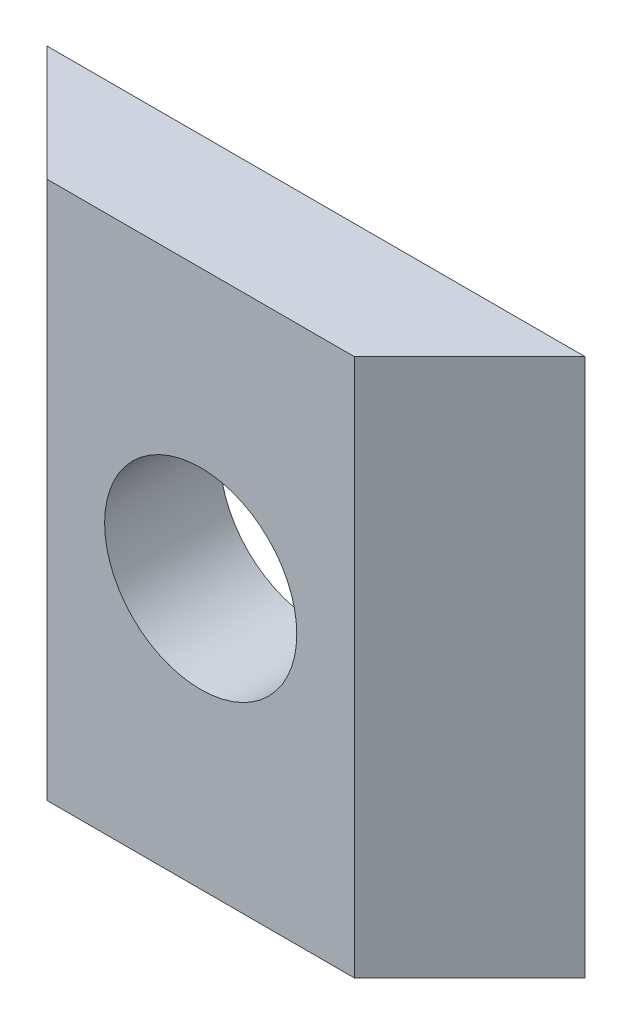
ISO-10303-21;
HEADER;
FILE_DESCRIPTION(('STEP AP214'),'2;1');
FILE_NAME('part.step','',(''),(''),'','','');
FILE_SCHEMA(('AUTOMOTIVE_DESIGN { 1 0 10303 214 1 1 1 1 }'));
ENDSEC;
DATA;
#1=APPLICATION_CONTEXT('core data for automotive mechanical design processes');
#2=APPLICATION_PROTOCOL_DEFINITION('international standard','automotive_design',2000,#1);
#3=PRODUCT_CONTEXT('',#1,'mechanical');
#4=PRODUCT('Part','Part','',(#3));
#5=PRODUCT_RELATED_PRODUCT_CATEGORY('part','',(#4));
#6=PRODUCT_DEFINITION_FORMATION('','',#4);
#7=PRODUCT_DEFINITION_CONTEXT('part definition',#1,'design');
#8=PRODUCT_DEFINITION('design','',#6,#7);
#9=PRODUCT_DEFINITION_SHAPE('','',#8);
#10=(LENGTH_UNIT() NAMED_UNIT(*) SI_UNIT(.MILLI.,.METRE.));
#11=(NAMED_UNIT(*) PLANE_ANGLE_UNIT() SI_UNIT($,.RADIAN.));
#12=(NAMED_UNIT(*) SI_UNIT($,.STERADIAN.) SOLID_ANGLE_UNIT());
#13=UNCERTAINTY_MEASURE_WITH_UNIT(LENGTH_MEASURE(1.E-05),#10,'distance_accuracy_value','');
#14=(GEOMETRIC_REPRESENTATION_CONTEXT(3) GLOBAL_UNCERTAINTY_ASSIGNED_CONTEXT((#13)) GLOBAL_UNIT_ASSIGNED_CONTEXT((#10,
#11,#12)) REPRESENTATION_CONTEXT('',''));
#15=CARTESIAN_POINT('',(0.,0.,0.));
#16=DIRECTION('',(0.,0.,1.));
#17=DIRECTION('',(1.,0.,0.));
#18=AXIS2_PLACEMENT_3D('',#15,#16,#17);
#19=CARTESIAN_POINT('',(2.75000000000006,7.,2.75000000000001));
#20=DIRECTION('',(0.707106781186553,0.,0.707106781186542));
#21=DIRECTION('',(0.707106781186542,0.,-0.707106781186553));
#22=AXIS2_PLACEMENT_3D('',#19,#20,#21);
#23=PLANE('',#22);
#24=DIRECTION('',(-0.707106781186542,0.,0.707106781186553));
#25=VECTOR('',#24,1.);
#26=CARTESIAN_POINT('',(2.75000000000006,-7.,2.75000000000001));
#27=LINE('',#26,#25);
#28=CARTESIAN_POINT('',(7.,-7.,-1.5));
#29=VERTEX_POINT('',#28);
#30=CARTESIAN_POINT('',(4.00000000000005,-7.,1.5));
#31=VERTEX_POINT('',#30);
#32=EDGE_CURVE('E99',#29,#31,#27,.T.);
#33=ORIENTED_EDGE('',*,*,#32,.F.);
#34=DIRECTION('',(0.,-1.,0.));
#35=VECTOR('',#34,1.);
#36=CARTESIAN_POINT('',(7.,7.,-1.5));
#37=LINE('',#36,#35);
#38=CARTESIAN_POINT('',(7.,7.,-1.5));
#39=VERTEX_POINT('',#38);
#40=EDGE_CURVE('E11',#39,#29,#37,.T.);
#41=ORIENTED_EDGE('',*,*,#40,.F.);
#42=DIRECTION('',(-0.707106781186542,0.,0.707106781186553));
#43=VECTOR('',#42,1.);
#44=CARTESIAN_POINT('',(2.75000000000006,7.,2.75000000000001));
#45=LINE('',#44,#43);
#46=CARTESIAN_POINT('',(4.00000000000005,7.,1.5));
#47=VERTEX_POINT('',#46);
#48=EDGE_CURVE('E92',#39,#47,#45,.T.);
#49=ORIENTED_EDGE('',*,*,#48,.T.);
#50=DIRECTION('',(0.,-1.,0.));
#51=VECTOR('',#50,1.);
#52=CARTESIAN_POINT('',(4.00000000000005,7.,1.5));
#53=LINE('',#52,#51);
#54=EDGE_CURVE('E72',#47,#31,#53,.T.);
#55=ORIENTED_EDGE('',*,*,#54,.T.);
#56=EDGE_LOOP('',(#33,#41,#49,#55));
#57=FACE_BOUND('',#56,.T.);
#58=ADVANCED_FACE('F33',(#57),#23,.T.);
#59=CARTESIAN_POINT('',(0.,7.,-1.5));
#60=DIRECTION('',(0.,0.,-1.));
#61=DIRECTION('',(-1.,0.,0.));
#62=AXIS2_PLACEMENT_3D('',#59,#60,#61);
#63=PLANE('',#62);
#64=CARTESIAN_POINT('',(0.,0.,-1.5));
#65=DIRECTION('',(0.,0.,-1.));
#66=DIRECTION('',(-1.,0.,0.));
#67=AXIS2_PLACEMENT_3D('',#64,#65,#66);
#68=CIRCLE('',#67,2.5);
#69=CARTESIAN_POINT('',(-2.5,0.,-1.5));
#70=VERTEX_POINT('',#69);
#71=EDGE_CURVE('E136',#70,#70,#68,.T.);
#72=ORIENTED_EDGE('',*,*,#71,.F.);
#73=EDGE_LOOP('',(#72));
#74=FACE_BOUND('',#73,.T.);
#75=DIRECTION('',(1.,0.,0.));
#76=VECTOR('',#75,1.);
#77=CARTESIAN_POINT('',(0.,-7.,-1.5));
#78=LINE('',#77,#76);
#79=CARTESIAN_POINT('',(-7.,-7.,-1.5));
#80=VERTEX_POINT('',#79);
#81=EDGE_CURVE('E85',#80,#29,#78,.T.);
#82=ORIENTED_EDGE('',*,*,#81,.F.);
#83=DIRECTION('',(0.,-1.,0.));
#84=VECTOR('',#83,1.);
#85=CARTESIAN_POINT('',(-7.,7.,-1.5));
#86=LINE('',#85,#84);
#87=CARTESIAN_POINT('',(-7.,7.,-1.5));
#88=VERTEX_POINT('',#87);
#89=EDGE_CURVE('E42',#88,#80,#86,.T.);
#90=ORIENTED_EDGE('',*,*,#89,.F.);
#91=DIRECTION('',(1.,0.,0.));
#92=VECTOR('',#91,1.);
#93=CARTESIAN_POINT('',(0.,7.,-1.5));
#94=LINE('',#93,#92);
#95=EDGE_CURVE('E83',#88,#39,#94,.T.);
#96=ORIENTED_EDGE('',*,*,#95,.T.);
#97=ORIENTED_EDGE('',*,*,#40,.T.);
#98=EDGE_LOOP('',(#82,#90,#96,#97));
#99=FACE_BOUND('',#98,.T.);
#100=ADVANCED_FACE('F81',(#74,#99),#63,.T.);
#101=CARTESIAN_POINT('',(-2.74999999999992,7.,2.74999999999998));
#102=DIRECTION('',(0.707106781186539,0.,-0.707106781186556));
#103=DIRECTION('',(-0.707106781186556,0.,-0.707106781186539));
#104=AXIS2_PLACEMENT_3D('',#101,#102,#103);
#105=PLANE('',#104);
#106=DIRECTION('',(0.707106781186556,0.,0.707106781186539));
#107=VECTOR('',#106,1.);
#108=CARTESIAN_POINT('',(-2.74999999999992,-7.,2.74999999999998));
#109=LINE('',#108,#107);
#110=CARTESIAN_POINT('',(-3.99999999999993,-7.,1.5));
#111=VERTEX_POINT('',#110);
#112=EDGE_CURVE('E65',#80,#111,#109,.T.);
#113=ORIENTED_EDGE('',*,*,#112,.T.);
#114=DIRECTION('',(0.,-1.,0.));
#115=VECTOR('',#114,1.);
#116=CARTESIAN_POINT('',(-3.99999999999993,7.,1.5));
#117=LINE('',#116,#115);
#118=CARTESIAN_POINT('',(-3.99999999999993,7.,1.5));
#119=VERTEX_POINT('',#118);
#120=EDGE_CURVE('E86',#119,#111,#117,.T.);
#121=ORIENTED_EDGE('',*,*,#120,.F.);
#122=DIRECTION('',(0.707106781186556,0.,0.707106781186539));
#123=VECTOR('',#122,1.);
#124=CARTESIAN_POINT('',(-2.74999999999992,7.,2.74999999999998));
#125=LINE('',#124,#123);
#126=EDGE_CURVE('E88',#88,#119,#125,.T.);
#127=ORIENTED_EDGE('',*,*,#126,.F.);
#128=ORIENTED_EDGE('',*,*,#89,.T.);
#129=EDGE_LOOP('',(#113,#121,#127,#128));
#130=FACE_BOUND('',#129,.T.);
#131=ADVANCED_FACE('F89',(#130),#105,.F.);
#132=CARTESIAN_POINT('',(0.,7.,1.5));
#133=DIRECTION('',(0.,0.,-1.));
#134=DIRECTION('',(-1.,0.,0.));
#135=AXIS2_PLACEMENT_3D('',#132,#133,#134);
#136=PLANE('',#135);
#137=CARTESIAN_POINT('',(0.,0.,1.5));
#138=DIRECTION('',(0.,0.,-1.));
#139=DIRECTION('',(-1.,0.,0.));
#140=AXIS2_PLACEMENT_3D('',#137,#138,#139);
#141=CIRCLE('',#140,2.5);
#142=CARTESIAN_POINT('',(-2.5,0.,1.5));
#143=VERTEX_POINT('',#142);
#144=EDGE_CURVE('E36',#143,#143,#141,.T.);
#145=ORIENTED_EDGE('',*,*,#144,.T.);
#146=EDGE_LOOP('',(#145));
#147=FACE_BOUND('',#146,.T.);
#148=DIRECTION('',(1.,0.,0.));
#149=VECTOR('',#148,1.);
#150=CARTESIAN_POINT('',(0.,-7.,1.5));
#151=LINE('',#150,#149);
#152=EDGE_CURVE('E94',#111,#31,#151,.T.);
#153=ORIENTED_EDGE('',*,*,#152,.T.);
#154=ORIENTED_EDGE('',*,*,#54,.F.);
#155=DIRECTION('',(1.,0.,0.));
#156=VECTOR('',#155,1.);
#157=CARTESIAN_POINT('',(0.,7.,1.5));
#158=LINE('',#157,#156);
#159=EDGE_CURVE('E50',#119,#47,#158,.T.);
#160=ORIENTED_EDGE('',*,*,#159,.F.);
#161=ORIENTED_EDGE('',*,*,#120,.T.);
#162=EDGE_LOOP('',(#153,#154,#160,#161));
#163=FACE_BOUND('',#162,.T.);
#164=ADVANCED_FACE('F108',(#147,#163),#136,.F.);
#165=CARTESIAN_POINT('',(0.,7.,0.));
#166=DIRECTION('',(0.,1.,0.));
#167=DIRECTION('',(0.,0.,1.));
#168=AXIS2_PLACEMENT_3D('',#165,#166,#167);
#169=PLANE('',#168);
#170=ORIENTED_EDGE('',*,*,#48,.F.);
#171=ORIENTED_EDGE('',*,*,#95,.F.);
#172=ORIENTED_EDGE('',*,*,#126,.T.);
#173=ORIENTED_EDGE('',*,*,#159,.T.);
#174=EDGE_LOOP('',(#170,#171,#172,#173));
#175=FACE_BOUND('',#174,.T.);
#176=ADVANCED_FACE('F91',(#175),#169,.T.);
#177=CARTESIAN_POINT('',(0.,-7.,0.));
#178=DIRECTION('',(0.,1.,0.));
#179=DIRECTION('',(0.,0.,1.));
#180=AXIS2_PLACEMENT_3D('',#177,#178,#179);
#181=PLANE('',#180);
#182=ORIENTED_EDGE('',*,*,#32,.T.);
#183=ORIENTED_EDGE('',*,*,#152,.F.);
#184=ORIENTED_EDGE('',*,*,#112,.F.);
#185=ORIENTED_EDGE('',*,*,#81,.T.);
#186=EDGE_LOOP('',(#182,#183,#184,#185));
#187=FACE_BOUND('',#186,.T.);
#188=ADVANCED_FACE('F110',(#187),#181,.F.);
#189=CARTESIAN_POINT('',(0.,0.,12.5));
#190=DIRECTION('',(0.,0.,-1.));
#191=DIRECTION('',(-1.,0.,0.));
#192=AXIS2_PLACEMENT_3D('',#189,#190,#191);
#193=CYLINDRICAL_SURFACE('',#192,2.5);
#194=ORIENTED_EDGE('',*,*,#71,.T.);
#195=EDGE_LOOP('',(#194));
#196=FACE_BOUND('',#195,.T.);
#197=ORIENTED_EDGE('',*,*,#144,.F.);
#198=EDGE_LOOP('',(#197));
#199=FACE_BOUND('',#198,.T.);
#200=ADVANCED_FACE('F127',(#196,#199),#193,.F.);
#201=CLOSED_SHELL('',(#58,#100,#131,#164,#176,#188,#200));
#202=MANIFOLD_SOLID_BREP('B2',#201);
#203=ADVANCED_BREP_SHAPE_REPRESENTATION('',(#18,#202),#14);
#204=SHAPE_DEFINITION_REPRESENTATION(#9,#203);
ENDSEC;
END-ISO-10303-21;
